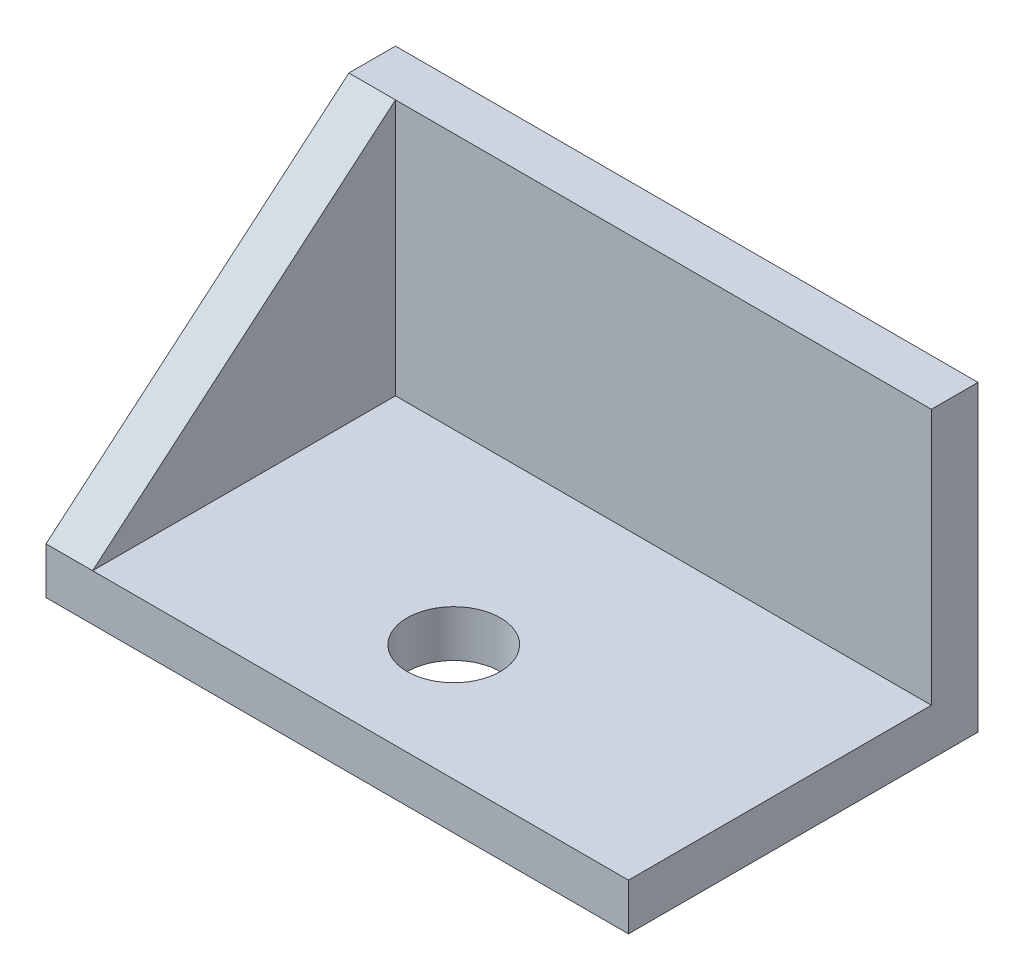
ISO-10303-21;
HEADER;
FILE_DESCRIPTION(('STEP AP214'),'2;1');
FILE_NAME('part.step','',(''),(''),'','','');
FILE_SCHEMA(('AUTOMOTIVE_DESIGN { 1 0 10303 214 1 1 1 1 }'));
ENDSEC;
DATA;
#1=APPLICATION_CONTEXT('core data for automotive mechanical design processes');
#2=APPLICATION_PROTOCOL_DEFINITION('international standard','automotive_design',2000,#1);
#3=PRODUCT_CONTEXT('',#1,'mechanical');
#4=PRODUCT('Part','Part','',(#3));
#5=PRODUCT_RELATED_PRODUCT_CATEGORY('part','',(#4));
#6=PRODUCT_DEFINITION_FORMATION('','',#4);
#7=PRODUCT_DEFINITION_CONTEXT('part definition',#1,'design');
#8=PRODUCT_DEFINITION('design','',#6,#7);
#9=PRODUCT_DEFINITION_SHAPE('','',#8);
#10=(LENGTH_UNIT() NAMED_UNIT(*) SI_UNIT(.MILLI.,.METRE.));
#11=(NAMED_UNIT(*) PLANE_ANGLE_UNIT() SI_UNIT($,.RADIAN.));
#12=(NAMED_UNIT(*) SI_UNIT($,.STERADIAN.) SOLID_ANGLE_UNIT());
#13=UNCERTAINTY_MEASURE_WITH_UNIT(LENGTH_MEASURE(1.E-05),#10,'distance_accuracy_value','');
#14=(GEOMETRIC_REPRESENTATION_CONTEXT(3) GLOBAL_UNCERTAINTY_ASSIGNED_CONTEXT((#13)) GLOBAL_UNIT_ASSIGNED_CONTEXT((#10,
#11,#12)) REPRESENTATION_CONTEXT('',''));
#15=CARTESIAN_POINT('',(0.,0.,0.));
#16=DIRECTION('',(0.,0.,1.));
#17=DIRECTION('',(1.,0.,0.));
#18=AXIS2_PLACEMENT_3D('',#15,#16,#17);
#19=CARTESIAN_POINT('',(125.,0.,75.));
#20=DIRECTION('',(0.,0.,-1.));
#21=DIRECTION('',(-1.,0.,0.));
#22=AXIS2_PLACEMENT_3D('',#19,#20,#21);
#23=PLANE('',#22);
#24=DIRECTION('',(0.,-1.,0.));
#25=VECTOR('',#24,1.);
#26=CARTESIAN_POINT('',(0.,0.,75.));
#27=LINE('',#26,#25);
#28=CARTESIAN_POINT('',(0.,9.99999999999999,75.));
#29=VERTEX_POINT('',#28);
#30=CARTESIAN_POINT('',(0.,0.,75.));
#31=VERTEX_POINT('',#30);
#32=EDGE_CURVE('E129',#29,#31,#27,.T.);
#33=ORIENTED_EDGE('',*,*,#32,.T.);
#34=DIRECTION('',(-1.,0.,0.));
#35=VECTOR('',#34,1.);
#36=CARTESIAN_POINT('',(125.,0.,75.));
#37=LINE('',#36,#35);
#38=CARTESIAN_POINT('',(125.,0.,75.));
#39=VERTEX_POINT('',#38);
#40=EDGE_CURVE('E11',#39,#31,#37,.T.);
#41=ORIENTED_EDGE('',*,*,#40,.F.);
#42=DIRECTION('',(0.,-1.,0.));
#43=VECTOR('',#42,1.);
#44=CARTESIAN_POINT('',(125.,0.,75.));
#45=LINE('',#44,#43);
#46=CARTESIAN_POINT('',(125.,9.99999999999999,75.));
#47=VERTEX_POINT('',#46);
#48=EDGE_CURVE('E137',#47,#39,#45,.T.);
#49=ORIENTED_EDGE('',*,*,#48,.F.);
#50=DIRECTION('',(-1.,0.,0.));
#51=VECTOR('',#50,1.);
#52=CARTESIAN_POINT('',(125.,9.99999999999999,75.));
#53=LINE('',#52,#51);
#54=CARTESIAN_POINT('',(9.99999999999999,9.99999999999999,75.));
#55=VERTEX_POINT('',#54);
#56=EDGE_CURVE('E125',#47,#55,#53,.T.);
#57=ORIENTED_EDGE('',*,*,#56,.T.);
#58=DIRECTION('',(-1.,0.,0.));
#59=VECTOR('',#58,1.);
#60=CARTESIAN_POINT('',(10.,9.99999999999999,75.));
#61=LINE('',#60,#59);
#62=EDGE_CURVE('E52',#55,#29,#61,.T.);
#63=ORIENTED_EDGE('',*,*,#62,.T.);
#64=EDGE_LOOP('',(#33,#41,#49,#57,#63));
#65=FACE_BOUND('',#64,.T.);
#66=ADVANCED_FACE('F39',(#65),#23,.F.);
#67=CARTESIAN_POINT('',(125.,0.,0.));
#68=DIRECTION('',(0.,1.,0.));
#69=DIRECTION('',(0.,0.,1.));
#70=AXIS2_PLACEMENT_3D('',#67,#68,#69);
#71=PLANE('',#70);
#72=CARTESIAN_POINT('',(62.5,0.,50.));
#73=DIRECTION('',(0.,1.,0.));
#74=DIRECTION('',(0.,0.,1.));
#75=AXIS2_PLACEMENT_3D('',#72,#73,#74);
#76=CIRCLE('',#75,9.99999999999999);
#77=CARTESIAN_POINT('',(62.5,0.,60.));
#78=VERTEX_POINT('',#77);
#79=EDGE_CURVE('E165',#78,#78,#76,.T.);
#80=ORIENTED_EDGE('',*,*,#79,.T.);
#81=EDGE_LOOP('',(#80));
#82=FACE_BOUND('',#81,.T.);
#83=DIRECTION('',(0.,0.,-1.));
#84=VECTOR('',#83,1.);
#85=CARTESIAN_POINT('',(0.,0.,0.));
#86=LINE('',#85,#84);
#87=CARTESIAN_POINT('',(0.,0.,0.));
#88=VERTEX_POINT('',#87);
#89=EDGE_CURVE('E135',#31,#88,#86,.T.);
#90=ORIENTED_EDGE('',*,*,#89,.T.);
#91=DIRECTION('',(-1.,0.,0.));
#92=VECTOR('',#91,1.);
#93=CARTESIAN_POINT('',(125.,0.,0.));
#94=LINE('',#93,#92);
#95=CARTESIAN_POINT('',(125.,0.,0.));
#96=VERTEX_POINT('',#95);
#97=EDGE_CURVE('E46',#96,#88,#94,.T.);
#98=ORIENTED_EDGE('',*,*,#97,.F.);
#99=DIRECTION('',(0.,0.,-1.));
#100=VECTOR('',#99,1.);
#101=CARTESIAN_POINT('',(125.,0.,0.));
#102=LINE('',#101,#100);
#103=EDGE_CURVE('E90',#39,#96,#102,.T.);
#104=ORIENTED_EDGE('',*,*,#103,.F.);
#105=ORIENTED_EDGE('',*,*,#40,.T.);
#106=EDGE_LOOP('',(#90,#98,#104,#105));
#107=FACE_BOUND('',#106,.T.);
#108=ADVANCED_FACE('F173',(#82,#107),#71,.F.);
#109=CARTESIAN_POINT('',(125.,0.,0.));
#110=DIRECTION('',(0.,0.,1.));
#111=DIRECTION('',(1.,0.,0.));
#112=AXIS2_PLACEMENT_3D('',#109,#110,#111);
#113=PLANE('',#112);
#114=DIRECTION('',(0.,1.,0.));
#115=VECTOR('',#114,1.);
#116=CARTESIAN_POINT('',(0.,0.,0.));
#117=LINE('',#116,#115);
#118=CARTESIAN_POINT('',(0.,65.,0.));
#119=VERTEX_POINT('',#118);
#120=EDGE_CURVE('E81',#88,#119,#117,.T.);
#121=ORIENTED_EDGE('',*,*,#120,.T.);
#122=DIRECTION('',(-1.,0.,0.));
#123=VECTOR('',#122,1.);
#124=CARTESIAN_POINT('',(125.,65.,0.));
#125=LINE('',#124,#123);
#126=CARTESIAN_POINT('',(125.,65.,0.));
#127=VERTEX_POINT('',#126);
#128=EDGE_CURVE('E116',#127,#119,#125,.T.);
#129=ORIENTED_EDGE('',*,*,#128,.F.);
#130=DIRECTION('',(0.,1.,0.));
#131=VECTOR('',#130,1.);
#132=CARTESIAN_POINT('',(125.,0.,0.));
#133=LINE('',#132,#131);
#134=EDGE_CURVE('E106',#96,#127,#133,.T.);
#135=ORIENTED_EDGE('',*,*,#134,.F.);
#136=ORIENTED_EDGE('',*,*,#97,.T.);
#137=EDGE_LOOP('',(#121,#129,#135,#136));
#138=FACE_BOUND('',#137,.T.);
#139=ADVANCED_FACE('F143',(#138),#113,.F.);
#140=CARTESIAN_POINT('',(125.,65.,0.));
#141=DIRECTION('',(0.,-1.,0.));
#142=DIRECTION('',(0.,0.,-1.));
#143=AXIS2_PLACEMENT_3D('',#140,#141,#142);
#144=PLANE('',#143);
#145=DIRECTION('',(0.,0.,1.));
#146=VECTOR('',#145,1.);
#147=CARTESIAN_POINT('',(0.,65.,0.));
#148=LINE('',#147,#146);
#149=CARTESIAN_POINT('',(0.,65.,10.));
#150=VERTEX_POINT('',#149);
#151=EDGE_CURVE('E133',#119,#150,#148,.T.);
#152=ORIENTED_EDGE('',*,*,#151,.T.);
#153=DIRECTION('',(-1.,0.,0.));
#154=VECTOR('',#153,1.);
#155=CARTESIAN_POINT('',(10.,65.,10.));
#156=LINE('',#155,#154);
#157=CARTESIAN_POINT('',(10.,65.,10.));
#158=VERTEX_POINT('',#157);
#159=EDGE_CURVE('E117',#158,#150,#156,.T.);
#160=ORIENTED_EDGE('',*,*,#159,.F.);
#161=DIRECTION('',(-1.,0.,0.));
#162=VECTOR('',#161,1.);
#163=CARTESIAN_POINT('',(125.,65.,10.));
#164=LINE('',#163,#162);
#165=CARTESIAN_POINT('',(125.,65.,10.));
#166=VERTEX_POINT('',#165);
#167=EDGE_CURVE('E112',#166,#158,#164,.T.);
#168=ORIENTED_EDGE('',*,*,#167,.F.);
#169=DIRECTION('',(0.,0.,1.));
#170=VECTOR('',#169,1.);
#171=CARTESIAN_POINT('',(125.,65.,0.));
#172=LINE('',#171,#170);
#173=EDGE_CURVE('E97',#127,#166,#172,.T.);
#174=ORIENTED_EDGE('',*,*,#173,.F.);
#175=ORIENTED_EDGE('',*,*,#128,.T.);
#176=EDGE_LOOP('',(#152,#160,#168,#174,#175));
#177=FACE_BOUND('',#176,.T.);
#178=ADVANCED_FACE('F114',(#177),#144,.F.);
#179=CARTESIAN_POINT('',(125.,0.,9.99999999999999));
#180=DIRECTION('',(0.,0.,-1.));
#181=DIRECTION('',(0.,1.,0.));
#182=AXIS2_PLACEMENT_3D('',#179,#180,#181);
#183=PLANE('',#182);
#184=ORIENTED_EDGE('',*,*,#167,.T.);
#185=DIRECTION('',(0.,-1.,0.));
#186=VECTOR('',#185,1.);
#187=CARTESIAN_POINT('',(10.,0.,9.99999999999999));
#188=LINE('',#187,#186);
#189=CARTESIAN_POINT('',(10.,10.,9.99999999999999));
#190=VERTEX_POINT('',#189);
#191=EDGE_CURVE('E158',#158,#190,#188,.T.);
#192=ORIENTED_EDGE('',*,*,#191,.T.);
#193=DIRECTION('',(-1.,0.,0.));
#194=VECTOR('',#193,1.);
#195=CARTESIAN_POINT('',(125.,10.,9.99999999999999));
#196=LINE('',#195,#194);
#197=CARTESIAN_POINT('',(125.,10.,9.99999999999999));
#198=VERTEX_POINT('',#197);
#199=EDGE_CURVE('E118',#198,#190,#196,.T.);
#200=ORIENTED_EDGE('',*,*,#199,.F.);
#201=DIRECTION('',(0.,-1.,0.));
#202=VECTOR('',#201,1.);
#203=CARTESIAN_POINT('',(125.,0.,9.99999999999999));
#204=LINE('',#203,#202);
#205=EDGE_CURVE('E103',#166,#198,#204,.T.);
#206=ORIENTED_EDGE('',*,*,#205,.F.);
#207=EDGE_LOOP('',(#184,#192,#200,#206));
#208=FACE_BOUND('',#207,.T.);
#209=ADVANCED_FACE('F122',(#208),#183,.F.);
#210=CARTESIAN_POINT('',(125.,10.,0.));
#211=DIRECTION('',(0.,-1.,0.));
#212=DIRECTION('',(0.,0.,-1.));
#213=AXIS2_PLACEMENT_3D('',#210,#211,#212);
#214=PLANE('',#213);
#215=CARTESIAN_POINT('',(62.5,10.,50.));
#216=DIRECTION('',(0.,1.,0.));
#217=DIRECTION('',(0.,0.,1.));
#218=AXIS2_PLACEMENT_3D('',#215,#216,#217);
#219=CIRCLE('',#218,9.99999999999999);
#220=CARTESIAN_POINT('',(62.5,9.99999999999999,60.));
#221=VERTEX_POINT('',#220);
#222=EDGE_CURVE('E164',#221,#221,#219,.T.);
#223=ORIENTED_EDGE('',*,*,#222,.F.);
#224=EDGE_LOOP('',(#223));
#225=FACE_BOUND('',#224,.T.);
#226=ORIENTED_EDGE('',*,*,#199,.T.);
#227=DIRECTION('',(0.,0.,1.));
#228=VECTOR('',#227,1.);
#229=CARTESIAN_POINT('',(10.,10.,0.));
#230=LINE('',#229,#228);
#231=EDGE_CURVE('E160',#190,#55,#230,.T.);
#232=ORIENTED_EDGE('',*,*,#231,.T.);
#233=ORIENTED_EDGE('',*,*,#56,.F.);
#234=DIRECTION('',(0.,0.,1.));
#235=VECTOR('',#234,1.);
#236=CARTESIAN_POINT('',(125.,10.,0.));
#237=LINE('',#236,#235);
#238=EDGE_CURVE('E65',#198,#47,#237,.T.);
#239=ORIENTED_EDGE('',*,*,#238,.F.);
#240=EDGE_LOOP('',(#226,#232,#233,#239));
#241=FACE_BOUND('',#240,.T.);
#242=ADVANCED_FACE('F191',(#225,#241),#214,.F.);
#243=CARTESIAN_POINT('',(125.,0.,0.));
#244=DIRECTION('',(1.,0.,0.));
#245=DIRECTION('',(0.,0.,-1.));
#246=AXIS2_PLACEMENT_3D('',#243,#244,#245);
#247=PLANE('',#246);
#248=ORIENTED_EDGE('',*,*,#48,.T.);
#249=ORIENTED_EDGE('',*,*,#103,.T.);
#250=ORIENTED_EDGE('',*,*,#134,.T.);
#251=ORIENTED_EDGE('',*,*,#173,.T.);
#252=ORIENTED_EDGE('',*,*,#205,.T.);
#253=ORIENTED_EDGE('',*,*,#238,.T.);
#254=EDGE_LOOP('',(#248,#249,#250,#251,#252,#253));
#255=FACE_BOUND('',#254,.T.);
#256=ADVANCED_FACE('F101',(#255),#247,.T.);
#257=CARTESIAN_POINT('',(0.,0.,0.));
#258=DIRECTION('',(1.,0.,0.));
#259=DIRECTION('',(0.,0.,-1.));
#260=AXIS2_PLACEMENT_3D('',#257,#258,#259);
#261=PLANE('',#260);
#262=ORIENTED_EDGE('',*,*,#32,.F.);
#263=DIRECTION('',(0.,-0.645942241466174,0.763386285369115));
#264=VECTOR('',#263,1.);
#265=CARTESIAN_POINT('',(0.,42.8103448275862,36.2241379310345));
#266=LINE('',#265,#264);
#267=EDGE_CURVE('E146',#150,#29,#266,.T.);
#268=ORIENTED_EDGE('',*,*,#267,.F.);
#269=ORIENTED_EDGE('',*,*,#151,.F.);
#270=ORIENTED_EDGE('',*,*,#120,.F.);
#271=ORIENTED_EDGE('',*,*,#89,.F.);
#272=EDGE_LOOP('',(#262,#268,#269,#270,#271));
#273=FACE_BOUND('',#272,.T.);
#274=ADVANCED_FACE('F144',(#273),#261,.F.);
#275=CARTESIAN_POINT('',(10.,42.8103448275862,36.2241379310345));
#276=DIRECTION('',(0.,-0.763386285369115,-0.645942241466174));
#277=DIRECTION('',(0.,0.645942241466174,-0.763386285369115));
#278=AXIS2_PLACEMENT_3D('',#275,#276,#277);
#279=PLANE('',#278);
#280=ORIENTED_EDGE('',*,*,#267,.T.);
#281=ORIENTED_EDGE('',*,*,#62,.F.);
#282=DIRECTION('',(0.,-0.645942241466174,0.763386285369115));
#283=VECTOR('',#282,1.);
#284=CARTESIAN_POINT('',(10.,42.8103448275862,36.2241379310345));
#285=LINE('',#284,#283);
#286=EDGE_CURVE('E155',#158,#55,#285,.T.);
#287=ORIENTED_EDGE('',*,*,#286,.F.);
#288=ORIENTED_EDGE('',*,*,#159,.T.);
#289=EDGE_LOOP('',(#280,#281,#287,#288));
#290=FACE_BOUND('',#289,.T.);
#291=ADVANCED_FACE('F152',(#290),#279,.F.);
#292=CARTESIAN_POINT('',(10.,0.,0.));
#293=DIRECTION('',(1.,0.,0.));
#294=DIRECTION('',(0.,0.,-1.));
#295=AXIS2_PLACEMENT_3D('',#292,#293,#294);
#296=PLANE('',#295);
#297=ORIENTED_EDGE('',*,*,#191,.F.);
#298=ORIENTED_EDGE('',*,*,#286,.T.);
#299=ORIENTED_EDGE('',*,*,#231,.F.);
#300=EDGE_LOOP('',(#297,#298,#299));
#301=FACE_BOUND('',#300,.T.);
#302=ADVANCED_FACE('F159',(#301),#296,.T.);
#303=CARTESIAN_POINT('',(62.5,0.,50.));
#304=DIRECTION('',(0.,1.,0.));
#305=DIRECTION('',(0.,0.,1.));
#306=AXIS2_PLACEMENT_3D('',#303,#304,#305);
#307=CYLINDRICAL_SURFACE('',#306,9.99999999999999);
#308=ORIENTED_EDGE('',*,*,#79,.F.);
#309=EDGE_LOOP('',(#308));
#310=FACE_BOUND('',#309,.T.);
#311=ORIENTED_EDGE('',*,*,#222,.T.);
#312=EDGE_LOOP('',(#311));
#313=FACE_BOUND('',#312,.T.);
#314=ADVANCED_FACE('F203',(#310,#313),#307,.F.);
#315=CLOSED_SHELL('',(#66,#108,#139,#178,#209,#242,#256,#274,#291,#302,#314));
#316=MANIFOLD_SOLID_BREP('B2',#315);
#317=ADVANCED_BREP_SHAPE_REPRESENTATION('',(#18,#316),#14);
#318=SHAPE_DEFINITION_REPRESENTATION(#9,#317);
ENDSEC;
END-ISO-10303-21;
